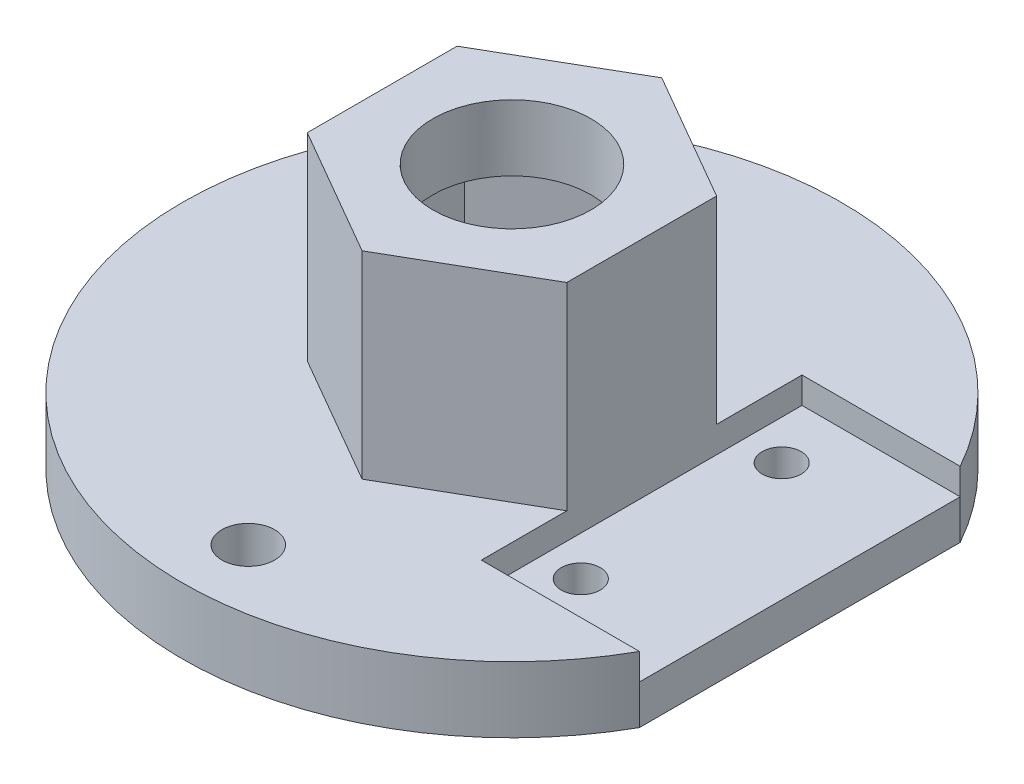
ISO-10303-21;
HEADER;
FILE_DESCRIPTION(('STEP AP214'),'2;1');
FILE_NAME('part.step','',(''),(''),'','','');
FILE_SCHEMA(('AUTOMOTIVE_DESIGN { 1 0 10303 214 1 1 1 1 }'));
ENDSEC;
DATA;
#1=APPLICATION_CONTEXT('core data for automotive mechanical design processes');
#2=APPLICATION_PROTOCOL_DEFINITION('international standard','automotive_design',2000,#1);
#3=PRODUCT_CONTEXT('',#1,'mechanical');
#4=PRODUCT('Part','Part','',(#3));
#5=PRODUCT_RELATED_PRODUCT_CATEGORY('part','',(#4));
#6=PRODUCT_DEFINITION_FORMATION('','',#4);
#7=PRODUCT_DEFINITION_CONTEXT('part definition',#1,'design');
#8=PRODUCT_DEFINITION('design','',#6,#7);
#9=PRODUCT_DEFINITION_SHAPE('','',#8);
#10=(LENGTH_UNIT() NAMED_UNIT(*) SI_UNIT(.MILLI.,.METRE.));
#11=(NAMED_UNIT(*) PLANE_ANGLE_UNIT() SI_UNIT($,.RADIAN.));
#12=(NAMED_UNIT(*) SI_UNIT($,.STERADIAN.) SOLID_ANGLE_UNIT());
#13=UNCERTAINTY_MEASURE_WITH_UNIT(LENGTH_MEASURE(1.E-05),#10,'distance_accuracy_value','');
#14=(GEOMETRIC_REPRESENTATION_CONTEXT(3) GLOBAL_UNCERTAINTY_ASSIGNED_CONTEXT((#13)) GLOBAL_UNIT_ASSIGNED_CONTEXT((#10,
#11,#12)) REPRESENTATION_CONTEXT('',''));
#15=CARTESIAN_POINT('',(0.,0.,0.));
#16=DIRECTION('',(0.,0.,1.));
#17=DIRECTION('',(1.,0.,0.));
#18=AXIS2_PLACEMENT_3D('',#15,#16,#17);
#19=CARTESIAN_POINT('',(0.,0.,0.));
#20=DIRECTION('',(0.,1.,0.));
#21=DIRECTION('',(0.,0.,1.));
#22=AXIS2_PLACEMENT_3D('',#19,#20,#21);
#23=CYLINDRICAL_SURFACE('',#22,6.);
#24=CARTESIAN_POINT('',(0.,20.,0.));
#25=DIRECTION('',(0.,1.,0.));
#26=DIRECTION('',(0.,0.,1.));
#27=AXIS2_PLACEMENT_3D('',#24,#25,#26);
#28=CIRCLE('',#27,6.);
#29=CARTESIAN_POINT('',(0.,20.,6.));
#30=VERTEX_POINT('',#29);
#31=EDGE_CURVE('E316',#30,#30,#28,.T.);
#32=ORIENTED_EDGE('',*,*,#31,.T.);
#33=EDGE_LOOP('',(#32));
#34=FACE_BOUND('',#33,.T.);
#35=CARTESIAN_POINT('',(0.,15.,0.));
#36=DIRECTION('',(0.,-1.,0.));
#37=DIRECTION('',(0.,0.,-1.));
#38=AXIS2_PLACEMENT_3D('',#35,#36,#37);
#39=CIRCLE('',#38,6.);
#40=CARTESIAN_POINT('',(0.,15.,-6.));
#41=VERTEX_POINT('',#40);
#42=EDGE_CURVE('E75',#41,#41,#39,.F.);
#43=ORIENTED_EDGE('',*,*,#42,.F.);
#44=EDGE_LOOP('',(#43));
#45=FACE_BOUND('',#44,.T.);
#46=ADVANCED_FACE('F71',(#34,#45),#23,.F.);
#47=CARTESIAN_POINT('',(8.50000000000007,15.,-4.90747728811171));
#48=DIRECTION('',(1.,0.,0.));
#49=DIRECTION('',(0.,0.,-1.));
#50=AXIS2_PLACEMENT_3D('',#47,#48,#49);
#51=PLANE('',#50);
#52=DIRECTION('',(0.,-1.,0.));
#53=VECTOR('',#52,1.);
#54=CARTESIAN_POINT('',(8.5,15.,4.90747728811184));
#55=LINE('',#54,#53);
#56=CARTESIAN_POINT('',(8.49999999999993,15.,4.90747728811195));
#57=VERTEX_POINT('',#56);
#58=CARTESIAN_POINT('',(8.5,0.,4.90747728811184));
#59=VERTEX_POINT('',#58);
#60=EDGE_CURVE('E209',#57,#59,#55,.T.);
#61=ORIENTED_EDGE('',*,*,#60,.F.);
#62=DIRECTION('',(0.,0.,1.));
#63=VECTOR('',#62,1.);
#64=CARTESIAN_POINT('',(8.50000000000007,15.,-4.90747728811171));
#65=LINE('',#64,#63);
#66=CARTESIAN_POINT('',(8.50000000000007,15.,-4.90747728811171));
#67=VERTEX_POINT('',#66);
#68=EDGE_CURVE('E224',#67,#57,#65,.T.);
#69=ORIENTED_EDGE('',*,*,#68,.F.);
#70=DIRECTION('',(0.,-1.,0.));
#71=VECTOR('',#70,1.);
#72=CARTESIAN_POINT('',(8.50000000000007,15.,-4.90747728811171));
#73=LINE('',#72,#71);
#74=CARTESIAN_POINT('',(8.50000000000007,0.,-4.90747728811171));
#75=VERTEX_POINT('',#74);
#76=EDGE_CURVE('E313',#67,#75,#73,.T.);
#77=ORIENTED_EDGE('',*,*,#76,.T.);
#78=DIRECTION('',(0.,0.,1.));
#79=VECTOR('',#78,1.);
#80=CARTESIAN_POINT('',(8.50000000000007,0.,-4.90747728811171));
#81=LINE('',#80,#79);
#82=EDGE_CURVE('E275',#75,#59,#81,.T.);
#83=ORIENTED_EDGE('',*,*,#82,.T.);
#84=EDGE_LOOP('',(#61,#69,#77,#83));
#85=FACE_BOUND('',#84,.T.);
#86=ADVANCED_FACE('F461',(#85),#51,.F.);
#87=CARTESIAN_POINT('',(1.04950770296597E-13,15.,-9.81495457622365));
#88=DIRECTION('',(0.50000000000001,0.,-0.866025403784433));
#89=DIRECTION('',(-0.866025403784433,0.,-0.50000000000001));
#90=AXIS2_PLACEMENT_3D('',#87,#88,#89);
#91=PLANE('',#90);
#92=ORIENTED_EDGE('',*,*,#76,.F.);
#93=DIRECTION('',(0.866025403784433,0.,0.50000000000001));
#94=VECTOR('',#93,1.);
#95=CARTESIAN_POINT('',(1.04966654484469E-13,15.,-9.81495457622365));
#96=LINE('',#95,#94);
#97=CARTESIAN_POINT('',(1.04966654484469E-13,15.,-9.81495457622365));
#98=VERTEX_POINT('',#97);
#99=EDGE_CURVE('E234',#98,#67,#96,.T.);
#100=ORIENTED_EDGE('',*,*,#99,.F.);
#101=DIRECTION('',(0.,-1.,0.));
#102=VECTOR('',#101,1.);
#103=CARTESIAN_POINT('',(1.04950770296597E-13,15.,-9.81495457622365));
#104=LINE('',#103,#102);
#105=CARTESIAN_POINT('',(1.04950770296597E-13,0.,-9.81495457622365));
#106=VERTEX_POINT('',#105);
#107=EDGE_CURVE('E317',#98,#106,#104,.T.);
#108=ORIENTED_EDGE('',*,*,#107,.T.);
#109=DIRECTION('',(0.866025403784433,0.,0.50000000000001));
#110=VECTOR('',#109,1.);
#111=CARTESIAN_POINT('',(1.04950770296597E-13,0.,-9.81495457622365));
#112=LINE('',#111,#110);
#113=EDGE_CURVE('E309',#106,#75,#112,.T.);
#114=ORIENTED_EDGE('',*,*,#113,.T.);
#115=EDGE_LOOP('',(#92,#100,#108,#114));
#116=FACE_BOUND('',#115,.T.);
#117=ADVANCED_FACE('F467',(#116),#91,.F.);
#118=CARTESIAN_POINT('',(-8.49999999999997,15.,-4.9074772881119));
#119=DIRECTION('',(-0.499999999999992,0.,-0.866025403784443));
#120=DIRECTION('',(-0.866025403784443,0.,0.499999999999992));
#121=AXIS2_PLACEMENT_3D('',#118,#119,#120);
#122=PLANE('',#121);
#123=ORIENTED_EDGE('',*,*,#107,.F.);
#124=DIRECTION('',(0.866025403784443,0.,-0.499999999999992));
#125=VECTOR('',#124,1.);
#126=CARTESIAN_POINT('',(-8.49999999999997,15.,-4.90747728811189));
#127=LINE('',#126,#125);
#128=CARTESIAN_POINT('',(-8.49999999999997,15.,-4.90747728811189));
#129=VERTEX_POINT('',#128);
#130=EDGE_CURVE('E230',#129,#98,#127,.T.);
#131=ORIENTED_EDGE('',*,*,#130,.F.);
#132=DIRECTION('',(0.,-1.,0.));
#133=VECTOR('',#132,1.);
#134=CARTESIAN_POINT('',(-8.49999999999997,15.,-4.9074772881119));
#135=LINE('',#134,#133);
#136=CARTESIAN_POINT('',(-8.49999999999997,0.,-4.9074772881119));
#137=VERTEX_POINT('',#136);
#138=EDGE_CURVE('E320',#129,#137,#135,.T.);
#139=ORIENTED_EDGE('',*,*,#138,.T.);
#140=DIRECTION('',(0.866025403784443,0.,-0.499999999999992));
#141=VECTOR('',#140,1.);
#142=CARTESIAN_POINT('',(-8.49999999999997,0.,-4.9074772881119));
#143=LINE('',#142,#141);
#144=EDGE_CURVE('E305',#137,#106,#143,.T.);
#145=ORIENTED_EDGE('',*,*,#144,.T.);
#146=EDGE_LOOP('',(#123,#131,#139,#145));
#147=FACE_BOUND('',#146,.T.);
#148=ADVANCED_FACE('F535',(#147),#122,.F.);
#149=CARTESIAN_POINT('',(-8.50000000000004,15.,4.90747728811177));
#150=DIRECTION('',(-1.,0.,0.));
#151=DIRECTION('',(0.,0.,1.));
#152=AXIS2_PLACEMENT_3D('',#149,#150,#151);
#153=PLANE('',#152);
#154=ORIENTED_EDGE('',*,*,#138,.F.);
#155=DIRECTION('',(0.,0.,-1.));
#156=VECTOR('',#155,1.);
#157=CARTESIAN_POINT('',(-8.50000000000004,15.,4.90747728811177));
#158=LINE('',#157,#156);
#159=CARTESIAN_POINT('',(-8.50000000000004,15.,4.90747728811177));
#160=VERTEX_POINT('',#159);
#161=EDGE_CURVE('E218',#160,#129,#158,.T.);
#162=ORIENTED_EDGE('',*,*,#161,.F.);
#163=DIRECTION('',(0.,-1.,0.));
#164=VECTOR('',#163,1.);
#165=CARTESIAN_POINT('',(-8.50000000000004,15.,4.90747728811177));
#166=LINE('',#165,#164);
#167=CARTESIAN_POINT('',(-8.50000000000004,0.,4.90747728811177));
#168=VERTEX_POINT('',#167);
#169=EDGE_CURVE('E208',#160,#168,#166,.T.);
#170=ORIENTED_EDGE('',*,*,#169,.T.);
#171=DIRECTION('',(0.,0.,-1.));
#172=VECTOR('',#171,1.);
#173=CARTESIAN_POINT('',(-8.50000000000004,0.,4.90747728811177));
#174=LINE('',#173,#172);
#175=EDGE_CURVE('E301',#168,#137,#174,.T.);
#176=ORIENTED_EDGE('',*,*,#175,.T.);
#177=EDGE_LOOP('',(#154,#162,#170,#176));
#178=FACE_BOUND('',#177,.T.);
#179=ADVANCED_FACE('F528',(#178),#153,.F.);
#180=CARTESIAN_POINT('',(0.,15.,9.81495457622365));
#181=DIRECTION('',(-0.500000000000004,0.,0.866025403784436));
#182=DIRECTION('',(0.866025403784436,0.,0.500000000000004));
#183=AXIS2_PLACEMENT_3D('',#180,#181,#182);
#184=PLANE('',#183);
#185=ORIENTED_EDGE('',*,*,#169,.F.);
#186=DIRECTION('',(-0.866025403784436,0.,-0.500000000000004));
#187=VECTOR('',#186,1.);
#188=CARTESIAN_POINT('',(0.,15.,9.81495457622365));
#189=LINE('',#188,#187);
#190=CARTESIAN_POINT('',(0.,15.,9.81495457622365));
#191=VERTEX_POINT('',#190);
#192=EDGE_CURVE('E212',#191,#160,#189,.T.);
#193=ORIENTED_EDGE('',*,*,#192,.F.);
#194=DIRECTION('',(0.,-1.,0.));
#195=VECTOR('',#194,1.);
#196=CARTESIAN_POINT('',(0.,15.,9.81495457622365));
#197=LINE('',#196,#195);
#198=CARTESIAN_POINT('',(0.,0.,9.81495457622365));
#199=VERTEX_POINT('',#198);
#200=EDGE_CURVE('E196',#191,#199,#197,.T.);
#201=ORIENTED_EDGE('',*,*,#200,.T.);
#202=DIRECTION('',(-0.866025403784436,0.,-0.500000000000004));
#203=VECTOR('',#202,1.);
#204=CARTESIAN_POINT('',(0.,0.,9.81495457622365));
#205=LINE('',#204,#203);
#206=EDGE_CURVE('E298',#199,#168,#205,.T.);
#207=ORIENTED_EDGE('',*,*,#206,.T.);
#208=EDGE_LOOP('',(#185,#193,#201,#207));
#209=FACE_BOUND('',#208,.T.);
#210=ADVANCED_FACE('F213',(#209),#184,.F.);
#211=CARTESIAN_POINT('',(8.5,15.,4.90747728811184));
#212=DIRECTION('',(0.499999999999998,0.,0.86602540378444));
#213=DIRECTION('',(0.86602540378444,0.,-0.499999999999998));
#214=AXIS2_PLACEMENT_3D('',#211,#212,#213);
#215=PLANE('',#214);
#216=ORIENTED_EDGE('',*,*,#200,.F.);
#217=DIRECTION('',(-0.866025403784443,0.,0.499999999999992));
#218=VECTOR('',#217,1.);
#219=CARTESIAN_POINT('',(8.49999999999993,15.,4.90747728811195));
#220=LINE('',#219,#218);
#221=EDGE_CURVE('E200',#57,#191,#220,.T.);
#222=ORIENTED_EDGE('',*,*,#221,.F.);
#223=ORIENTED_EDGE('',*,*,#60,.T.);
#224=DIRECTION('',(-0.86602540378444,0.,0.499999999999998));
#225=VECTOR('',#224,1.);
#226=CARTESIAN_POINT('',(8.5,0.,4.90747728811184));
#227=LINE('',#226,#225);
#228=EDGE_CURVE('E203',#59,#199,#227,.T.);
#229=ORIENTED_EDGE('',*,*,#228,.T.);
#230=EDGE_LOOP('',(#216,#222,#223,#229));
#231=FACE_BOUND('',#230,.T.);
#232=ADVANCED_FACE('F198',(#231),#215,.F.);
#233=CARTESIAN_POINT('',(0.,5.,0.));
#234=DIRECTION('',(0.,1.,0.));
#235=DIRECTION('',(0.,0.,1.));
#236=AXIS2_PLACEMENT_3D('',#233,#234,#235);
#237=PLANE('',#236);
#238=DIRECTION('',(0.,0.,-1.));
#239=VECTOR('',#238,1.);
#240=CARTESIAN_POINT('',(9.84238166216474,5.,12.1618404579377));
#241=LINE('',#240,#239);
#242=CARTESIAN_POINT('',(9.84238166216474,5.,12.1618404579377));
#243=VERTEX_POINT('',#242);
#244=CARTESIAN_POINT('',(9.84238166216474,5.,5.68250170211773));
#245=VERTEX_POINT('',#244);
#246=EDGE_CURVE('E377',#243,#245,#241,.T.);
#247=ORIENTED_EDGE('',*,*,#246,.T.);
#248=DIRECTION('',(0.866025403784433,0.,-0.50000000000001));
#249=VECTOR('',#248,1.);
#250=CARTESIAN_POINT('',(1.22298005056365E-13,5.,11.3650034042357));
#251=LINE('',#250,#249);
#252=CARTESIAN_POINT('',(1.21430643318376E-13,5.,11.3650034042357));
#253=VERTEX_POINT('',#252);
#254=EDGE_CURVE('E250',#253,#245,#251,.T.);
#255=ORIENTED_EDGE('',*,*,#254,.F.);
#256=DIRECTION('',(0.866025403784443,0.,0.499999999999992));
#257=VECTOR('',#256,1.);
#258=CARTESIAN_POINT('',(-9.8423816621647,5.,5.68250170211794));
#259=LINE('',#258,#257);
#260=CARTESIAN_POINT('',(-9.8423816621647,5.,5.68250170211794));
#261=VERTEX_POINT('',#260);
#262=EDGE_CURVE('E89',#261,#253,#259,.T.);
#263=ORIENTED_EDGE('',*,*,#262,.F.);
#264=DIRECTION('',(0.,0.,1.));
#265=VECTOR('',#264,1.);
#266=CARTESIAN_POINT('',(-9.84238166216478,5.,-5.6825017021178));
#267=LINE('',#266,#265);
#268=CARTESIAN_POINT('',(-9.84238166216478,5.,-5.6825017021178));
#269=VERTEX_POINT('',#268);
#270=EDGE_CURVE('E97',#269,#261,#267,.T.);
#271=ORIENTED_EDGE('',*,*,#270,.F.);
#272=DIRECTION('',(-0.866025403784436,0.,0.500000000000004));
#273=VECTOR('',#272,1.);
#274=CARTESIAN_POINT('',(0.,5.,-11.3650034042357));
#275=LINE('',#274,#273);
#276=CARTESIAN_POINT('',(0.,5.,-11.3650034042357));
#277=VERTEX_POINT('',#276);
#278=EDGE_CURVE('E242',#277,#269,#275,.T.);
#279=ORIENTED_EDGE('',*,*,#278,.F.);
#280=DIRECTION('',(-0.86602540378444,0.,-0.499999999999998));
#281=VECTOR('',#280,1.);
#282=CARTESIAN_POINT('',(9.84238166216474,5.,-5.68250170211787));
#283=LINE('',#282,#281);
#284=CARTESIAN_POINT('',(9.84238166216474,5.,-5.68250170211787));
#285=VERTEX_POINT('',#284);
#286=EDGE_CURVE('E239',#285,#277,#283,.T.);
#287=ORIENTED_EDGE('',*,*,#286,.F.);
#288=CARTESIAN_POINT('',(9.84238166216474,5.,-12.1618404579377));
#289=VERTEX_POINT('',#288);
#290=EDGE_CURVE('E376',#285,#289,#241,.T.);
#291=ORIENTED_EDGE('',*,*,#290,.T.);
#292=DIRECTION('',(-1.,0.,0.));
#293=VECTOR('',#292,1.);
#294=CARTESIAN_POINT('',(21.8423816621647,5.,-12.1618404579377));
#295=LINE('',#294,#293);
#296=CARTESIAN_POINT('',(21.8423816621647,5.,-12.1618404579377));
#297=VERTEX_POINT('',#296);
#298=EDGE_CURVE('E349',#297,#289,#295,.T.);
#299=ORIENTED_EDGE('',*,*,#298,.F.);
#300=CARTESIAN_POINT('',(0.,5.,0.));
#301=DIRECTION('',(0.,1.,0.));
#302=DIRECTION('',(0.,0.,1.));
#303=AXIS2_PLACEMENT_3D('',#300,#301,#302);
#304=CIRCLE('',#303,25.);
#305=CARTESIAN_POINT('',(21.8423816621647,5.,12.1618404579377));
#306=VERTEX_POINT('',#305);
#307=EDGE_CURVE('E12',#297,#306,#304,.T.);
#308=ORIENTED_EDGE('',*,*,#307,.T.);
#309=DIRECTION('',(-1.,0.,0.));
#310=VECTOR('',#309,1.);
#311=CARTESIAN_POINT('',(21.8423816621647,5.,12.1618404579377));
#312=LINE('',#311,#310);
#313=EDGE_CURVE('E366',#306,#243,#312,.T.);
#314=ORIENTED_EDGE('',*,*,#313,.T.);
#315=EDGE_LOOP('',(#247,#255,#263,#271,#279,#287,#291,#299,#308,#314));
#316=FACE_BOUND('',#315,.T.);
#317=CARTESIAN_POINT('',(0.,5.,20.));
#318=DIRECTION('',(0.,1.,0.));
#319=DIRECTION('',(0.,0.,1.));
#320=AXIS2_PLACEMENT_3D('',#317,#318,#319);
#321=CIRCLE('',#320,2.);
#322=CARTESIAN_POINT('',(0.,5.,22.));
#323=VERTEX_POINT('',#322);
#324=EDGE_CURVE('E398',#323,#323,#321,.T.);
#325=ORIENTED_EDGE('',*,*,#324,.F.);
#326=EDGE_LOOP('',(#325));
#327=FACE_BOUND('',#326,.T.);
#328=CARTESIAN_POINT('',(-17.3205080756888,5.,-9.9999999999999));
#329=DIRECTION('',(0.,1.,0.));
#330=DIRECTION('',(0.,0.,1.));
#331=AXIS2_PLACEMENT_3D('',#328,#329,#330);
#332=CIRCLE('',#331,2.);
#333=CARTESIAN_POINT('',(-17.3205080756888,5.,-7.9999999999999));
#334=VERTEX_POINT('',#333);
#335=EDGE_CURVE('E81',#334,#334,#332,.T.);
#336=ORIENTED_EDGE('',*,*,#335,.F.);
#337=EDGE_LOOP('',(#336));
#338=FACE_BOUND('',#337,.T.);
#339=ADVANCED_FACE('F437',(#316,#327,#338),#237,.T.);
#340=CARTESIAN_POINT('',(0.,5.,0.));
#341=DIRECTION('',(0.,-1.,0.));
#342=DIRECTION('',(0.,0.,-1.));
#343=AXIS2_PLACEMENT_3D('',#340,#341,#342);
#344=CYLINDRICAL_SURFACE('',#343,25.);
#345=DIRECTION('',(0.,1.,0.));
#346=VECTOR('',#345,1.);
#347=CARTESIAN_POINT('',(21.8423816621647,3.,-12.1618404579377));
#348=LINE('',#347,#346);
#349=CARTESIAN_POINT('',(21.8423816621647,3.,-12.1618404579377));
#350=VERTEX_POINT('',#349);
#351=EDGE_CURVE('E391',#350,#297,#348,.T.);
#352=ORIENTED_EDGE('',*,*,#351,.F.);
#353=DIRECTION('',(0.,1.,0.));
#354=VECTOR('',#353,1.);
#355=CARTESIAN_POINT('',(21.8423816621647,0.,-12.1618404579377));
#356=LINE('',#355,#354);
#357=CARTESIAN_POINT('',(21.8423816621647,0.,-12.1618404579377));
#358=VERTEX_POINT('',#357);
#359=EDGE_CURVE('E338',#358,#350,#356,.T.);
#360=ORIENTED_EDGE('',*,*,#359,.F.);
#361=CARTESIAN_POINT('',(0.,0.,0.));
#362=DIRECTION('',(0.,1.,0.));
#363=DIRECTION('',(0.,0.,1.));
#364=AXIS2_PLACEMENT_3D('',#361,#362,#363);
#365=CIRCLE('',#364,25.);
#366=CARTESIAN_POINT('',(21.8423816621647,0.,12.1618404579377));
#367=VERTEX_POINT('',#366);
#368=EDGE_CURVE('E402',#358,#367,#365,.T.);
#369=ORIENTED_EDGE('',*,*,#368,.T.);
#370=DIRECTION('',(0.,1.,0.));
#371=VECTOR('',#370,1.);
#372=CARTESIAN_POINT('',(21.8423816621647,0.,12.1618404579377));
#373=LINE('',#372,#371);
#374=CARTESIAN_POINT('',(21.8423816621647,3.,12.1618404579377));
#375=VERTEX_POINT('',#374);
#376=EDGE_CURVE('E335',#367,#375,#373,.T.);
#377=ORIENTED_EDGE('',*,*,#376,.T.);
#378=DIRECTION('',(0.,1.,0.));
#379=VECTOR('',#378,1.);
#380=CARTESIAN_POINT('',(21.8423816621647,3.,12.1618404579377));
#381=LINE('',#380,#379);
#382=EDGE_CURVE('E387',#375,#306,#381,.T.);
#383=ORIENTED_EDGE('',*,*,#382,.T.);
#384=ORIENTED_EDGE('',*,*,#307,.F.);
#385=EDGE_LOOP('',(#352,#360,#369,#377,#383,#384));
#386=FACE_BOUND('',#385,.T.);
#387=ADVANCED_FACE('F418',(#386),#344,.T.);
#388=CARTESIAN_POINT('',(0.,0.,0.));
#389=DIRECTION('',(0.,1.,0.));
#390=DIRECTION('',(0.,0.,1.));
#391=AXIS2_PLACEMENT_3D('',#388,#389,#390);
#392=PLANE('',#391);
#393=ORIENTED_EDGE('',*,*,#228,.F.);
#394=ORIENTED_EDGE('',*,*,#82,.F.);
#395=ORIENTED_EDGE('',*,*,#113,.F.);
#396=ORIENTED_EDGE('',*,*,#144,.F.);
#397=ORIENTED_EDGE('',*,*,#175,.F.);
#398=ORIENTED_EDGE('',*,*,#206,.F.);
#399=EDGE_LOOP('',(#393,#394,#395,#396,#397,#398));
#400=FACE_BOUND('',#399,.T.);
#401=CARTESIAN_POINT('',(12.8423816621647,0.,-7.62));
#402=DIRECTION('',(0.,1.,0.));
#403=DIRECTION('',(0.,0.,1.));
#404=AXIS2_PLACEMENT_3D('',#401,#402,#403);
#405=CIRCLE('',#404,1.48);
#406=CARTESIAN_POINT('',(12.8423816621647,0.,-6.14));
#407=VERTEX_POINT('',#406);
#408=EDGE_CURVE('E345',#407,#407,#405,.T.);
#409=ORIENTED_EDGE('',*,*,#408,.T.);
#410=EDGE_LOOP('',(#409));
#411=FACE_BOUND('',#410,.T.);
#412=CARTESIAN_POINT('',(12.8423816621647,0.,7.62000000000001));
#413=DIRECTION('',(0.,1.,0.));
#414=DIRECTION('',(0.,0.,1.));
#415=AXIS2_PLACEMENT_3D('',#412,#413,#414);
#416=CIRCLE('',#415,1.48);
#417=CARTESIAN_POINT('',(12.8423816621647,0.,9.1));
#418=VERTEX_POINT('',#417);
#419=EDGE_CURVE('E354',#418,#418,#416,.T.);
#420=ORIENTED_EDGE('',*,*,#419,.T.);
#421=EDGE_LOOP('',(#420));
#422=FACE_BOUND('',#421,.T.);
#423=CARTESIAN_POINT('',(-17.3205080756888,0.,-9.9999999999999));
#424=DIRECTION('',(0.,1.,0.));
#425=DIRECTION('',(0.,0.,1.));
#426=AXIS2_PLACEMENT_3D('',#423,#424,#425);
#427=CIRCLE('',#426,2.);
#428=CARTESIAN_POINT('',(-17.3205080756888,0.,-7.9999999999999));
#429=VERTEX_POINT('',#428);
#430=EDGE_CURVE('E409',#429,#429,#427,.T.);
#431=ORIENTED_EDGE('',*,*,#430,.T.);
#432=EDGE_LOOP('',(#431));
#433=FACE_BOUND('',#432,.T.);
#434=CARTESIAN_POINT('',(0.,0.,20.));
#435=DIRECTION('',(0.,1.,0.));
#436=DIRECTION('',(0.,0.,1.));
#437=AXIS2_PLACEMENT_3D('',#434,#435,#436);
#438=CIRCLE('',#437,2.);
#439=CARTESIAN_POINT('',(0.,0.,22.));
#440=VERTEX_POINT('',#439);
#441=EDGE_CURVE('E394',#440,#440,#438,.T.);
#442=ORIENTED_EDGE('',*,*,#441,.T.);
#443=EDGE_LOOP('',(#442));
#444=FACE_BOUND('',#443,.T.);
#445=ORIENTED_EDGE('',*,*,#368,.F.);
#446=DIRECTION('',(0.,0.,1.));
#447=VECTOR('',#446,1.);
#448=CARTESIAN_POINT('',(21.8423816621647,0.,-12.1618404579377));
#449=LINE('',#448,#447);
#450=EDGE_CURVE('E331',#358,#367,#449,.T.);
#451=ORIENTED_EDGE('',*,*,#450,.T.);
#452=EDGE_LOOP('',(#445,#451));
#453=FACE_BOUND('',#452,.T.);
#454=ADVANCED_FACE('F421',(#400,#411,#422,#433,#444,#453),#392,.F.);
#455=CARTESIAN_POINT('',(0.,5.,20.));
#456=DIRECTION('',(0.,-1.,0.));
#457=DIRECTION('',(0.,0.,-1.));
#458=AXIS2_PLACEMENT_3D('',#455,#456,#457);
#459=CYLINDRICAL_SURFACE('',#458,2.);
#460=ORIENTED_EDGE('',*,*,#324,.T.);
#461=EDGE_LOOP('',(#460));
#462=FACE_BOUND('',#461,.T.);
#463=ORIENTED_EDGE('',*,*,#441,.F.);
#464=EDGE_LOOP('',(#463));
#465=FACE_BOUND('',#464,.T.);
#466=ADVANCED_FACE('F73',(#462,#465),#459,.F.);
#467=CARTESIAN_POINT('',(-17.3205080756888,5.,-9.9999999999999));
#468=DIRECTION('',(0.,-1.,0.));
#469=DIRECTION('',(0.,0.,-1.));
#470=AXIS2_PLACEMENT_3D('',#467,#468,#469);
#471=CYLINDRICAL_SURFACE('',#470,2.);
#472=ORIENTED_EDGE('',*,*,#335,.T.);
#473=EDGE_LOOP('',(#472));
#474=FACE_BOUND('',#473,.T.);
#475=ORIENTED_EDGE('',*,*,#430,.F.);
#476=EDGE_LOOP('',(#475));
#477=FACE_BOUND('',#476,.T.);
#478=ADVANCED_FACE('F479',(#474,#477),#471,.F.);
#479=CARTESIAN_POINT('',(0.,3.,0.));
#480=DIRECTION('',(0.,1.,0.));
#481=DIRECTION('',(0.,0.,1.));
#482=AXIS2_PLACEMENT_3D('',#479,#480,#481);
#483=PLANE('',#482);
#484=DIRECTION('',(0.,0.,1.));
#485=VECTOR('',#484,1.);
#486=CARTESIAN_POINT('',(21.8423816621647,3.,-12.1618404579377));
#487=LINE('',#486,#485);
#488=EDGE_CURVE('E330',#350,#375,#487,.T.);
#489=ORIENTED_EDGE('',*,*,#488,.F.);
#490=DIRECTION('',(-1.,0.,0.));
#491=VECTOR('',#490,1.);
#492=CARTESIAN_POINT('',(21.8423816621647,3.,-12.1618404579377));
#493=LINE('',#492,#491);
#494=CARTESIAN_POINT('',(9.84238166216474,3.,-12.1618404579377));
#495=VERTEX_POINT('',#494);
#496=EDGE_CURVE('E361',#350,#495,#493,.T.);
#497=ORIENTED_EDGE('',*,*,#496,.T.);
#498=DIRECTION('',(0.,0.,-1.));
#499=VECTOR('',#498,1.);
#500=CARTESIAN_POINT('',(9.84238166216474,3.,12.1618404579377));
#501=LINE('',#500,#499);
#502=CARTESIAN_POINT('',(9.84238166216474,3.,12.1618404579377));
#503=VERTEX_POINT('',#502);
#504=EDGE_CURVE('E365',#503,#495,#501,.T.);
#505=ORIENTED_EDGE('',*,*,#504,.F.);
#506=DIRECTION('',(-1.,0.,0.));
#507=VECTOR('',#506,1.);
#508=CARTESIAN_POINT('',(21.8423816621647,3.,12.1618404579377));
#509=LINE('',#508,#507);
#510=EDGE_CURVE('E369',#375,#503,#509,.T.);
#511=ORIENTED_EDGE('',*,*,#510,.F.);
#512=EDGE_LOOP('',(#489,#497,#505,#511));
#513=FACE_BOUND('',#512,.T.);
#514=CARTESIAN_POINT('',(12.8423816621647,3.,-7.62));
#515=DIRECTION('',(0.,1.,0.));
#516=DIRECTION('',(0.,0.,1.));
#517=AXIS2_PLACEMENT_3D('',#514,#515,#516);
#518=CIRCLE('',#517,1.48);
#519=CARTESIAN_POINT('',(12.8423816621647,3.,-6.14));
#520=VERTEX_POINT('',#519);
#521=EDGE_CURVE('E350',#520,#520,#518,.T.);
#522=ORIENTED_EDGE('',*,*,#521,.F.);
#523=EDGE_LOOP('',(#522));
#524=FACE_BOUND('',#523,.T.);
#525=CARTESIAN_POINT('',(12.8423816621647,3.,7.62000000000001));
#526=DIRECTION('',(0.,1.,0.));
#527=DIRECTION('',(0.,0.,1.));
#528=AXIS2_PLACEMENT_3D('',#525,#526,#527);
#529=CIRCLE('',#528,1.48);
#530=CARTESIAN_POINT('',(12.8423816621647,3.,9.1));
#531=VERTEX_POINT('',#530);
#532=EDGE_CURVE('E341',#531,#531,#529,.T.);
#533=ORIENTED_EDGE('',*,*,#532,.F.);
#534=EDGE_LOOP('',(#533));
#535=FACE_BOUND('',#534,.T.);
#536=ADVANCED_FACE('F427',(#513,#524,#535),#483,.T.);
#537=CARTESIAN_POINT('',(21.8423816621647,3.,-12.1618404579377));
#538=DIRECTION('',(0.,0.,-1.));
#539=DIRECTION('',(-1.,0.,0.));
#540=AXIS2_PLACEMENT_3D('',#537,#538,#539);
#541=PLANE('',#540);
#542=ORIENTED_EDGE('',*,*,#298,.T.);
#543=DIRECTION('',(0.,1.,0.));
#544=VECTOR('',#543,1.);
#545=CARTESIAN_POINT('',(9.84238166216474,3.,-12.1618404579377));
#546=LINE('',#545,#544);
#547=EDGE_CURVE('E372',#495,#289,#546,.T.);
#548=ORIENTED_EDGE('',*,*,#547,.F.);
#549=ORIENTED_EDGE('',*,*,#496,.F.);
#550=ORIENTED_EDGE('',*,*,#351,.T.);
#551=EDGE_LOOP('',(#542,#548,#549,#550));
#552=FACE_BOUND('',#551,.T.);
#553=ADVANCED_FACE('F433',(#552),#541,.F.);
#554=CARTESIAN_POINT('',(21.8423816621647,3.,12.1618404579377));
#555=DIRECTION('',(0.,0.,-1.));
#556=DIRECTION('',(-1.,0.,0.));
#557=AXIS2_PLACEMENT_3D('',#554,#555,#556);
#558=PLANE('',#557);
#559=ORIENTED_EDGE('',*,*,#313,.F.);
#560=ORIENTED_EDGE('',*,*,#382,.F.);
#561=ORIENTED_EDGE('',*,*,#510,.T.);
#562=DIRECTION('',(0.,1.,0.));
#563=VECTOR('',#562,1.);
#564=CARTESIAN_POINT('',(9.84238166216474,3.,12.1618404579377));
#565=LINE('',#564,#563);
#566=EDGE_CURVE('E384',#503,#243,#565,.T.);
#567=ORIENTED_EDGE('',*,*,#566,.T.);
#568=EDGE_LOOP('',(#559,#560,#561,#567));
#569=FACE_BOUND('',#568,.T.);
#570=ADVANCED_FACE('F449',(#569),#558,.T.);
#571=CARTESIAN_POINT('',(9.84238166216474,3.,12.1618404579377));
#572=DIRECTION('',(1.,0.,0.));
#573=DIRECTION('',(0.,0.,-1.));
#574=AXIS2_PLACEMENT_3D('',#571,#572,#573);
#575=PLANE('',#574);
#576=ORIENTED_EDGE('',*,*,#290,.F.);
#577=DIRECTION('',(0.,1.,0.));
#578=VECTOR('',#577,1.);
#579=CARTESIAN_POINT('',(9.84238166216474,5.,-5.68250170211787));
#580=LINE('',#579,#578);
#581=CARTESIAN_POINT('',(9.84238166216474,20.,-5.68250170211787));
#582=VERTEX_POINT('',#581);
#583=EDGE_CURVE('E253',#285,#582,#580,.T.);
#584=ORIENTED_EDGE('',*,*,#583,.T.);
#585=DIRECTION('',(0.,0.,-1.));
#586=VECTOR('',#585,1.);
#587=CARTESIAN_POINT('',(9.84238166216482,20.,5.68250170211773));
#588=LINE('',#587,#586);
#589=CARTESIAN_POINT('',(9.84238166216482,20.,5.68250170211773));
#590=VERTEX_POINT('',#589);
#591=EDGE_CURVE('E254',#590,#582,#588,.T.);
#592=ORIENTED_EDGE('',*,*,#591,.F.);
#593=DIRECTION('',(0.,1.,0.));
#594=VECTOR('',#593,1.);
#595=CARTESIAN_POINT('',(9.84238166216482,5.,5.68250170211773));
#596=LINE('',#595,#594);
#597=EDGE_CURVE('E271',#245,#590,#596,.T.);
#598=ORIENTED_EDGE('',*,*,#597,.F.);
#599=ORIENTED_EDGE('',*,*,#246,.F.);
#600=ORIENTED_EDGE('',*,*,#566,.F.);
#601=ORIENTED_EDGE('',*,*,#504,.T.);
#602=ORIENTED_EDGE('',*,*,#547,.T.);
#603=EDGE_LOOP('',(#576,#584,#592,#598,#599,#600,#601,#602));
#604=FACE_BOUND('',#603,.T.);
#605=ADVANCED_FACE('F444',(#604),#575,.T.);
#606=CARTESIAN_POINT('',(12.8423816621647,0.,7.62000000000001));
#607=DIRECTION('',(0.,1.,0.));
#608=DIRECTION('',(0.,0.,1.));
#609=AXIS2_PLACEMENT_3D('',#606,#607,#608);
#610=CYLINDRICAL_SURFACE('',#609,1.48);
#611=ORIENTED_EDGE('',*,*,#419,.F.);
#612=EDGE_LOOP('',(#611));
#613=FACE_BOUND('',#612,.T.);
#614=ORIENTED_EDGE('',*,*,#532,.T.);
#615=EDGE_LOOP('',(#614));
#616=FACE_BOUND('',#615,.T.);
#617=ADVANCED_FACE('F456',(#613,#616),#610,.F.);
#618=CARTESIAN_POINT('',(12.8423816621647,0.,-7.62));
#619=DIRECTION('',(0.,1.,0.));
#620=DIRECTION('',(0.,0.,1.));
#621=AXIS2_PLACEMENT_3D('',#618,#619,#620);
#622=CYLINDRICAL_SURFACE('',#621,1.48);
#623=ORIENTED_EDGE('',*,*,#408,.F.);
#624=EDGE_LOOP('',(#623));
#625=FACE_BOUND('',#624,.T.);
#626=ORIENTED_EDGE('',*,*,#521,.T.);
#627=EDGE_LOOP('',(#626));
#628=FACE_BOUND('',#627,.T.);
#629=ADVANCED_FACE('F636',(#625,#628),#622,.F.);
#630=CARTESIAN_POINT('',(21.8423816621647,0.,-12.1618404579377));
#631=DIRECTION('',(-1.,0.,0.));
#632=DIRECTION('',(0.,0.,1.));
#633=AXIS2_PLACEMENT_3D('',#630,#631,#632);
#634=PLANE('',#633);
#635=ORIENTED_EDGE('',*,*,#488,.T.);
#636=ORIENTED_EDGE('',*,*,#376,.F.);
#637=ORIENTED_EDGE('',*,*,#450,.F.);
#638=ORIENTED_EDGE('',*,*,#359,.T.);
#639=EDGE_LOOP('',(#635,#636,#637,#638));
#640=FACE_BOUND('',#639,.T.);
#641=ADVANCED_FACE('F423',(#640),#634,.F.);
#642=CARTESIAN_POINT('',(0.,20.,0.));
#643=DIRECTION('',(0.,1.,0.));
#644=DIRECTION('',(0.,0.,1.));
#645=AXIS2_PLACEMENT_3D('',#642,#643,#644);
#646=PLANE('',#645);
#647=DIRECTION('',(0.866025403784443,0.,0.499999999999992));
#648=VECTOR('',#647,1.);
#649=CARTESIAN_POINT('',(-9.8423816621647,20.,5.68250170211794));
#650=LINE('',#649,#648);
#651=CARTESIAN_POINT('',(-9.8423816621647,20.,5.68250170211794));
#652=VERTEX_POINT('',#651);
#653=CARTESIAN_POINT('',(1.22298005056365E-13,20.,11.3650034042357));
#654=VERTEX_POINT('',#653);
#655=EDGE_CURVE('E266',#652,#654,#650,.T.);
#656=ORIENTED_EDGE('',*,*,#655,.T.);
#657=DIRECTION('',(0.866025403784433,0.,-0.50000000000001));
#658=VECTOR('',#657,1.);
#659=CARTESIAN_POINT('',(1.22298005056365E-13,20.,11.3650034042357));
#660=LINE('',#659,#658);
#661=EDGE_CURVE('E243',#654,#590,#660,.T.);
#662=ORIENTED_EDGE('',*,*,#661,.T.);
#663=ORIENTED_EDGE('',*,*,#591,.T.);
#664=DIRECTION('',(-0.86602540378444,0.,-0.499999999999998));
#665=VECTOR('',#664,1.);
#666=CARTESIAN_POINT('',(9.84238166216474,20.,-5.68250170211787));
#667=LINE('',#666,#665);
#668=CARTESIAN_POINT('',(0.,20.,-11.3650034042357));
#669=VERTEX_POINT('',#668);
#670=EDGE_CURVE('E257',#582,#669,#667,.T.);
#671=ORIENTED_EDGE('',*,*,#670,.T.);
#672=DIRECTION('',(-0.866025403784436,0.,0.500000000000004));
#673=VECTOR('',#672,1.);
#674=CARTESIAN_POINT('',(0.,20.,-11.3650034042357));
#675=LINE('',#674,#673);
#676=CARTESIAN_POINT('',(-9.84238166216478,20.,-5.6825017021178));
#677=VERTEX_POINT('',#676);
#678=EDGE_CURVE('E260',#669,#677,#675,.T.);
#679=ORIENTED_EDGE('',*,*,#678,.T.);
#680=DIRECTION('',(0.,0.,1.));
#681=VECTOR('',#680,1.);
#682=CARTESIAN_POINT('',(-9.84238166216478,20.,-5.6825017021178));
#683=LINE('',#682,#681);
#684=EDGE_CURVE('E263',#677,#652,#683,.T.);
#685=ORIENTED_EDGE('',*,*,#684,.T.);
#686=EDGE_LOOP('',(#656,#662,#663,#671,#679,#685));
#687=FACE_BOUND('',#686,.T.);
#688=ORIENTED_EDGE('',*,*,#31,.F.);
#689=EDGE_LOOP('',(#688));
#690=FACE_BOUND('',#689,.T.);
#691=ADVANCED_FACE('F611',(#687,#690),#646,.T.);
#692=CARTESIAN_POINT('',(1.22298005056365E-13,5.,11.3650034042357));
#693=DIRECTION('',(0.50000000000001,0.,0.866025403784433));
#694=DIRECTION('',(0.866025403784433,0.,-0.50000000000001));
#695=AXIS2_PLACEMENT_3D('',#692,#693,#694);
#696=PLANE('',#695);
#697=ORIENTED_EDGE('',*,*,#254,.T.);
#698=ORIENTED_EDGE('',*,*,#597,.T.);
#699=ORIENTED_EDGE('',*,*,#661,.F.);
#700=DIRECTION('',(0.,1.,0.));
#701=VECTOR('',#700,1.);
#702=CARTESIAN_POINT('',(1.22298005056365E-13,5.,11.3650034042357));
#703=LINE('',#702,#701);
#704=EDGE_CURVE('E276',#253,#654,#703,.T.);
#705=ORIENTED_EDGE('',*,*,#704,.F.);
#706=EDGE_LOOP('',(#697,#698,#699,#705));
#707=FACE_BOUND('',#706,.T.);
#708=ADVANCED_FACE('F602',(#707),#696,.T.);
#709=CARTESIAN_POINT('',(-9.8423816621647,5.,5.68250170211794));
#710=DIRECTION('',(-0.499999999999992,0.,0.866025403784443));
#711=DIRECTION('',(0.866025403784443,0.,0.499999999999992));
#712=AXIS2_PLACEMENT_3D('',#709,#710,#711);
#713=PLANE('',#712);
#714=ORIENTED_EDGE('',*,*,#262,.T.);
#715=ORIENTED_EDGE('',*,*,#704,.T.);
#716=ORIENTED_EDGE('',*,*,#655,.F.);
#717=DIRECTION('',(0.,1.,0.));
#718=VECTOR('',#717,1.);
#719=CARTESIAN_POINT('',(-9.8423816621647,5.,5.68250170211794));
#720=LINE('',#719,#718);
#721=EDGE_CURVE('E279',#261,#652,#720,.T.);
#722=ORIENTED_EDGE('',*,*,#721,.F.);
#723=EDGE_LOOP('',(#714,#715,#716,#722));
#724=FACE_BOUND('',#723,.T.);
#725=ADVANCED_FACE('F593',(#724),#713,.T.);
#726=CARTESIAN_POINT('',(-9.84238166216478,5.,-5.6825017021178));
#727=DIRECTION('',(-1.,0.,0.));
#728=DIRECTION('',(0.,0.,1.));
#729=AXIS2_PLACEMENT_3D('',#726,#727,#728);
#730=PLANE('',#729);
#731=ORIENTED_EDGE('',*,*,#270,.T.);
#732=ORIENTED_EDGE('',*,*,#721,.T.);
#733=ORIENTED_EDGE('',*,*,#684,.F.);
#734=DIRECTION('',(0.,1.,0.));
#735=VECTOR('',#734,1.);
#736=CARTESIAN_POINT('',(-9.84238166216478,5.,-5.6825017021178));
#737=LINE('',#736,#735);
#738=EDGE_CURVE('E282',#269,#677,#737,.T.);
#739=ORIENTED_EDGE('',*,*,#738,.F.);
#740=EDGE_LOOP('',(#731,#732,#733,#739));
#741=FACE_BOUND('',#740,.T.);
#742=ADVANCED_FACE('F583',(#741),#730,.T.);
#743=CARTESIAN_POINT('',(0.,5.,-11.3650034042357));
#744=DIRECTION('',(-0.500000000000004,0.,-0.866025403784436));
#745=DIRECTION('',(-0.866025403784436,0.,0.500000000000004));
#746=AXIS2_PLACEMENT_3D('',#743,#744,#745);
#747=PLANE('',#746);
#748=ORIENTED_EDGE('',*,*,#278,.T.);
#749=ORIENTED_EDGE('',*,*,#738,.T.);
#750=ORIENTED_EDGE('',*,*,#678,.F.);
#751=DIRECTION('',(0.,1.,0.));
#752=VECTOR('',#751,1.);
#753=CARTESIAN_POINT('',(0.,5.,-11.3650034042357));
#754=LINE('',#753,#752);
#755=EDGE_CURVE('E286',#277,#669,#754,.T.);
#756=ORIENTED_EDGE('',*,*,#755,.F.);
#757=EDGE_LOOP('',(#748,#749,#750,#756));
#758=FACE_BOUND('',#757,.T.);
#759=ADVANCED_FACE('F571',(#758),#747,.T.);
#760=CARTESIAN_POINT('',(9.84238166216474,5.,-5.68250170211787));
#761=DIRECTION('',(0.499999999999998,0.,-0.86602540378444));
#762=DIRECTION('',(-0.86602540378444,0.,-0.499999999999998));
#763=AXIS2_PLACEMENT_3D('',#760,#761,#762);
#764=PLANE('',#763);
#765=ORIENTED_EDGE('',*,*,#286,.T.);
#766=ORIENTED_EDGE('',*,*,#755,.T.);
#767=ORIENTED_EDGE('',*,*,#670,.F.);
#768=ORIENTED_EDGE('',*,*,#583,.F.);
#769=EDGE_LOOP('',(#765,#766,#767,#768));
#770=FACE_BOUND('',#769,.T.);
#771=ADVANCED_FACE('F566',(#770),#764,.T.);
#772=CARTESIAN_POINT('',(0.,15.,0.));
#773=DIRECTION('',(0.,-1.,0.));
#774=DIRECTION('',(0.,0.,-1.));
#775=AXIS2_PLACEMENT_3D('',#772,#773,#774);
#776=PLANE('',#775);
#777=ORIENTED_EDGE('',*,*,#221,.T.);
#778=ORIENTED_EDGE('',*,*,#192,.T.);
#779=ORIENTED_EDGE('',*,*,#161,.T.);
#780=ORIENTED_EDGE('',*,*,#130,.T.);
#781=ORIENTED_EDGE('',*,*,#99,.T.);
#782=ORIENTED_EDGE('',*,*,#68,.T.);
#783=EDGE_LOOP('',(#777,#778,#779,#780,#781,#782));
#784=FACE_BOUND('',#783,.T.);
#785=ORIENTED_EDGE('',*,*,#42,.T.);
#786=EDGE_LOOP('',(#785));
#787=FACE_BOUND('',#786,.T.);
#788=ADVANCED_FACE('F220',(#784,#787),#776,.T.);
#789=CLOSED_SHELL('',(#46,#86,#117,#148,#179,#210,#232,#339,#387,#454,#466,#478,#536,#553,#570,
#605,#617,#629,#641,#691,#708,#725,#742,#759,#771,#788));
#790=MANIFOLD_SOLID_BREP('B2',#789);
#791=ADVANCED_BREP_SHAPE_REPRESENTATION('',(#18,#790),#14);
#792=SHAPE_DEFINITION_REPRESENTATION(#9,#791);
ENDSEC;
END-ISO-10303-21;
